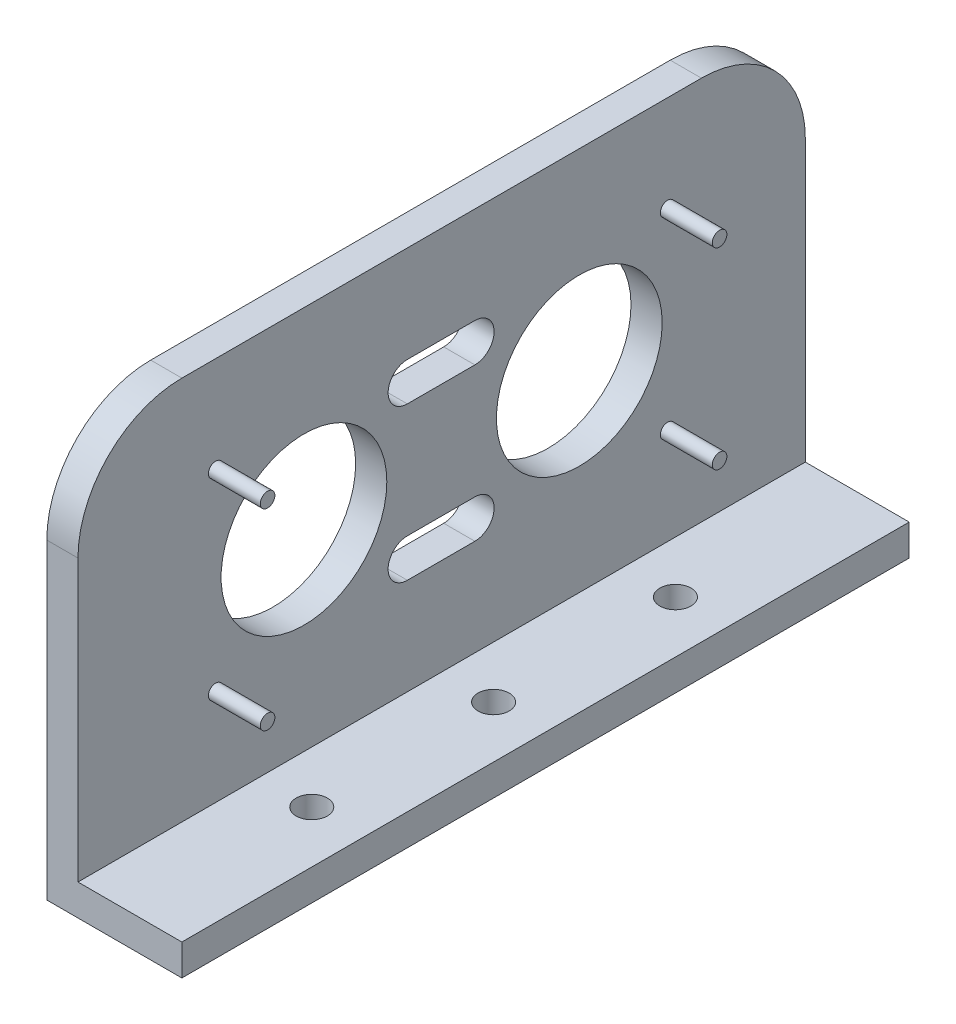
ISO-10303-21;
HEADER;
FILE_DESCRIPTION(('STEP AP214'),'2;1');
FILE_NAME('part.step','',(''),(''),'','','');
FILE_SCHEMA(('AUTOMOTIVE_DESIGN { 1 0 10303 214 1 1 1 1 }'));
ENDSEC;
DATA;
#1=APPLICATION_CONTEXT('core data for automotive mechanical design processes');
#2=APPLICATION_PROTOCOL_DEFINITION('international standard','automotive_design',2000,#1);
#3=PRODUCT_CONTEXT('',#1,'mechanical');
#4=PRODUCT('Part','Part','',(#3));
#5=PRODUCT_RELATED_PRODUCT_CATEGORY('part','',(#4));
#6=PRODUCT_DEFINITION_FORMATION('','',#4);
#7=PRODUCT_DEFINITION_CONTEXT('part definition',#1,'design');
#8=PRODUCT_DEFINITION('design','',#6,#7);
#9=PRODUCT_DEFINITION_SHAPE('','',#8);
#10=(LENGTH_UNIT() NAMED_UNIT(*) SI_UNIT(.MILLI.,.METRE.));
#11=(NAMED_UNIT(*) PLANE_ANGLE_UNIT() SI_UNIT($,.RADIAN.));
#12=(NAMED_UNIT(*) SI_UNIT($,.STERADIAN.) SOLID_ANGLE_UNIT());
#13=UNCERTAINTY_MEASURE_WITH_UNIT(LENGTH_MEASURE(1.E-05),#10,'distance_accuracy_value','');
#14=(GEOMETRIC_REPRESENTATION_CONTEXT(3) GLOBAL_UNCERTAINTY_ASSIGNED_CONTEXT((#13)) GLOBAL_UNIT_ASSIGNED_CONTEXT((#10,
#11,#12)) REPRESENTATION_CONTEXT('',''));
#15=CARTESIAN_POINT('',(0.,0.,0.));
#16=DIRECTION('',(0.,0.,1.));
#17=DIRECTION('',(1.,0.,0.));
#18=AXIS2_PLACEMENT_3D('',#15,#16,#17);
#19=CARTESIAN_POINT('',(-10.,30.,10.));
#20=DIRECTION('',(-1.,0.,0.));
#21=DIRECTION('',(0.,0.,1.));
#22=AXIS2_PLACEMENT_3D('',#19,#20,#21);
#23=CYLINDRICAL_SURFACE('',#22,10.);
#24=DIRECTION('',(-1.,0.,0.));
#25=VECTOR('',#24,1.);
#26=CARTESIAN_POINT('',(-10.,40.,10.));
#27=LINE('',#26,#25);
#28=CARTESIAN_POINT('',(-10.,40.,9.99999999999999));
#29=VERTEX_POINT('',#28);
#30=CARTESIAN_POINT('',(-13.,40.,9.99999999999999));
#31=VERTEX_POINT('',#30);
#32=EDGE_CURVE('E339',#29,#31,#27,.T.);
#33=ORIENTED_EDGE('',*,*,#32,.F.);
#34=CARTESIAN_POINT('',(-10.,30.,10.));
#35=DIRECTION('',(-1.,0.,0.));
#36=DIRECTION('',(0.,-1.,0.));
#37=AXIS2_PLACEMENT_3D('',#34,#35,#36);
#38=CIRCLE('',#37,10.);
#39=CARTESIAN_POINT('',(-10.,30.,0.));
#40=VERTEX_POINT('',#39);
#41=EDGE_CURVE('E347',#40,#29,#38,.F.);
#42=ORIENTED_EDGE('',*,*,#41,.F.);
#43=DIRECTION('',(-1.,0.,0.));
#44=VECTOR('',#43,1.);
#45=CARTESIAN_POINT('',(0.,30.,0.));
#46=LINE('',#45,#44);
#47=CARTESIAN_POINT('',(-13.,30.,0.));
#48=VERTEX_POINT('',#47);
#49=EDGE_CURVE('E343',#48,#40,#46,.F.);
#50=ORIENTED_EDGE('',*,*,#49,.F.);
#51=CARTESIAN_POINT('',(-13.,30.,10.));
#52=DIRECTION('',(1.,0.,0.));
#53=DIRECTION('',(0.,1.,0.));
#54=AXIS2_PLACEMENT_3D('',#51,#52,#53);
#55=CIRCLE('',#54,10.);
#56=EDGE_CURVE('E350',#31,#48,#55,.F.);
#57=ORIENTED_EDGE('',*,*,#56,.F.);
#58=EDGE_LOOP('',(#33,#42,#50,#57));
#59=FACE_BOUND('',#58,.T.);
#60=ADVANCED_FACE('F47',(#59),#23,.T.);
#61=CARTESIAN_POINT('',(-10.,30.,60.));
#62=DIRECTION('',(-1.,0.,0.));
#63=DIRECTION('',(0.,0.,1.));
#64=AXIS2_PLACEMENT_3D('',#61,#62,#63);
#65=CYLINDRICAL_SURFACE('',#64,10.);
#66=DIRECTION('',(1.,0.,0.));
#67=VECTOR('',#66,1.);
#68=CARTESIAN_POINT('',(-10.,40.,60.));
#69=LINE('',#68,#67);
#70=CARTESIAN_POINT('',(-13.,40.,60.));
#71=VERTEX_POINT('',#70);
#72=CARTESIAN_POINT('',(-10.,40.,60.));
#73=VERTEX_POINT('',#72);
#74=EDGE_CURVE('E325',#71,#73,#69,.T.);
#75=ORIENTED_EDGE('',*,*,#74,.F.);
#76=CARTESIAN_POINT('',(-13.,30.,60.));
#77=DIRECTION('',(1.,0.,0.));
#78=DIRECTION('',(0.,1.,0.));
#79=AXIS2_PLACEMENT_3D('',#76,#77,#78);
#80=CIRCLE('',#79,10.);
#81=CARTESIAN_POINT('',(-13.,30.,70.));
#82=VERTEX_POINT('',#81);
#83=EDGE_CURVE('E333',#82,#71,#80,.F.);
#84=ORIENTED_EDGE('',*,*,#83,.F.);
#85=DIRECTION('',(1.,0.,0.));
#86=VECTOR('',#85,1.);
#87=CARTESIAN_POINT('',(-10.,30.,70.));
#88=LINE('',#87,#86);
#89=CARTESIAN_POINT('',(-10.,30.,70.));
#90=VERTEX_POINT('',#89);
#91=EDGE_CURVE('E329',#90,#82,#88,.F.);
#92=ORIENTED_EDGE('',*,*,#91,.F.);
#93=CARTESIAN_POINT('',(-10.,30.,60.));
#94=DIRECTION('',(-1.,0.,0.));
#95=DIRECTION('',(0.,-1.,0.));
#96=AXIS2_PLACEMENT_3D('',#93,#94,#95);
#97=CIRCLE('',#96,10.);
#98=EDGE_CURVE('E336',#73,#90,#97,.F.);
#99=ORIENTED_EDGE('',*,*,#98,.F.);
#100=EDGE_LOOP('',(#75,#84,#92,#99));
#101=FACE_BOUND('',#100,.T.);
#102=ADVANCED_FACE('F426',(#101),#65,.T.);
#103=CARTESIAN_POINT('',(-10.,40.,70.));
#104=DIRECTION('',(0.,-1.,0.));
#105=DIRECTION('',(0.,0.,-1.));
#106=AXIS2_PLACEMENT_3D('',#103,#104,#105);
#107=PLANE('',#106);
#108=DIRECTION('',(0.,0.,-1.));
#109=VECTOR('',#108,1.);
#110=CARTESIAN_POINT('',(-10.,40.,70.));
#111=LINE('',#110,#109);
#112=EDGE_CURVE('E287',#73,#29,#111,.T.);
#113=ORIENTED_EDGE('',*,*,#112,.T.);
#114=ORIENTED_EDGE('',*,*,#32,.T.);
#115=DIRECTION('',(0.,0.,-1.));
#116=VECTOR('',#115,1.);
#117=CARTESIAN_POINT('',(-13.,40.,70.));
#118=LINE('',#117,#116);
#119=EDGE_CURVE('E321',#71,#31,#118,.T.);
#120=ORIENTED_EDGE('',*,*,#119,.F.);
#121=ORIENTED_EDGE('',*,*,#74,.T.);
#122=EDGE_LOOP('',(#113,#114,#120,#121));
#123=FACE_BOUND('',#122,.T.);
#124=ADVANCED_FACE('F433',(#123),#107,.F.);
#125=CARTESIAN_POINT('',(-13.,40.,70.));
#126=DIRECTION('',(1.,0.,0.));
#127=DIRECTION('',(0.,1.,0.));
#128=AXIS2_PLACEMENT_3D('',#125,#126,#127);
#129=PLANE('',#128);
#130=DIRECTION('',(0.,0.,-1.));
#131=VECTOR('',#130,1.);
#132=CARTESIAN_POINT('',(-13.,30.7,38.3));
#133=LINE('',#132,#131);
#134=CARTESIAN_POINT('',(-13.,30.7,38.3));
#135=VERTEX_POINT('',#134);
#136=CARTESIAN_POINT('',(-13.,30.7,31.8));
#137=VERTEX_POINT('',#136);
#138=EDGE_CURVE('E180',#135,#137,#133,.T.);
#139=ORIENTED_EDGE('',*,*,#138,.F.);
#140=CARTESIAN_POINT('',(-13.,28.85,38.3));
#141=DIRECTION('',(-1.,0.,0.));
#142=DIRECTION('',(0.,-1.,0.));
#143=AXIS2_PLACEMENT_3D('',#140,#141,#142);
#144=CIRCLE('',#143,1.85);
#145=CARTESIAN_POINT('',(-13.,27.,38.3));
#146=VERTEX_POINT('',#145);
#147=EDGE_CURVE('E64',#146,#135,#144,.T.);
#148=ORIENTED_EDGE('',*,*,#147,.F.);
#149=DIRECTION('',(0.,0.,1.));
#150=VECTOR('',#149,1.);
#151=CARTESIAN_POINT('',(-13.,27.,38.3));
#152=LINE('',#151,#150);
#153=CARTESIAN_POINT('',(-13.,27.,31.8));
#154=VERTEX_POINT('',#153);
#155=EDGE_CURVE('E188',#154,#146,#152,.T.);
#156=ORIENTED_EDGE('',*,*,#155,.F.);
#157=CARTESIAN_POINT('',(-13.,28.85,31.8));
#158=DIRECTION('',(-1.,0.,0.));
#159=DIRECTION('',(0.,-1.,0.));
#160=AXIS2_PLACEMENT_3D('',#157,#158,#159);
#161=CIRCLE('',#160,1.85);
#162=EDGE_CURVE('E169',#137,#154,#161,.T.);
#163=ORIENTED_EDGE('',*,*,#162,.F.);
#164=EDGE_LOOP('',(#139,#148,#156,#163));
#165=FACE_BOUND('',#164,.T.);
#166=DIRECTION('',(0.,0.,-1.));
#167=VECTOR('',#166,1.);
#168=CARTESIAN_POINT('',(-13.,16.,38.3));
#169=LINE('',#168,#167);
#170=CARTESIAN_POINT('',(-13.,16.,38.3));
#171=VERTEX_POINT('',#170);
#172=CARTESIAN_POINT('',(-13.,16.,31.8));
#173=VERTEX_POINT('',#172);
#174=EDGE_CURVE('E224',#171,#173,#169,.T.);
#175=ORIENTED_EDGE('',*,*,#174,.F.);
#176=CARTESIAN_POINT('',(-13.,14.15,38.3));
#177=DIRECTION('',(-1.,0.,0.));
#178=DIRECTION('',(0.,1.,0.));
#179=AXIS2_PLACEMENT_3D('',#176,#177,#178);
#180=CIRCLE('',#179,1.85);
#181=CARTESIAN_POINT('',(-13.,12.3,38.3));
#182=VERTEX_POINT('',#181);
#183=EDGE_CURVE('E72',#182,#171,#180,.T.);
#184=ORIENTED_EDGE('',*,*,#183,.F.);
#185=DIRECTION('',(0.,0.,1.));
#186=VECTOR('',#185,1.);
#187=CARTESIAN_POINT('',(-13.,12.3,38.3));
#188=LINE('',#187,#186);
#189=CARTESIAN_POINT('',(-13.,12.3,31.8));
#190=VERTEX_POINT('',#189);
#191=EDGE_CURVE('E206',#190,#182,#188,.T.);
#192=ORIENTED_EDGE('',*,*,#191,.F.);
#193=CARTESIAN_POINT('',(-13.,14.15,31.8));
#194=DIRECTION('',(-1.,0.,0.));
#195=DIRECTION('',(0.,1.,0.));
#196=AXIS2_PLACEMENT_3D('',#193,#194,#195);
#197=CIRCLE('',#196,1.85);
#198=EDGE_CURVE('E220',#173,#190,#197,.T.);
#199=ORIENTED_EDGE('',*,*,#198,.F.);
#200=EDGE_LOOP('',(#175,#184,#192,#199));
#201=FACE_BOUND('',#200,.T.);
#202=CARTESIAN_POINT('',(-13.,21.5,21.75));
#203=DIRECTION('',(1.,0.,0.));
#204=DIRECTION('',(0.,0.,-1.));
#205=AXIS2_PLACEMENT_3D('',#202,#203,#204);
#206=CIRCLE('',#205,7.975);
#207=CARTESIAN_POINT('',(-13.,21.5,13.775));
#208=VERTEX_POINT('',#207);
#209=EDGE_CURVE('E254',#208,#208,#206,.T.);
#210=ORIENTED_EDGE('',*,*,#209,.T.);
#211=EDGE_LOOP('',(#210));
#212=FACE_BOUND('',#211,.T.);
#213=CARTESIAN_POINT('',(-13.,21.5,48.25));
#214=DIRECTION('',(1.,0.,0.));
#215=DIRECTION('',(0.,0.,-1.));
#216=AXIS2_PLACEMENT_3D('',#213,#214,#215);
#217=CIRCLE('',#216,7.975);
#218=CARTESIAN_POINT('',(-13.,21.5,40.275));
#219=VERTEX_POINT('',#218);
#220=EDGE_CURVE('E262',#219,#219,#217,.T.);
#221=ORIENTED_EDGE('',*,*,#220,.T.);
#222=EDGE_LOOP('',(#221));
#223=FACE_BOUND('',#222,.T.);
#224=ORIENTED_EDGE('',*,*,#119,.T.);
#225=ORIENTED_EDGE('',*,*,#56,.T.);
#226=DIRECTION('',(0.,-1.,0.));
#227=VECTOR('',#226,1.);
#228=CARTESIAN_POINT('',(-13.,40.,0.));
#229=LINE('',#228,#227);
#230=CARTESIAN_POINT('',(-13.,0.,0.));
#231=VERTEX_POINT('',#230);
#232=EDGE_CURVE('E266',#48,#231,#229,.T.);
#233=ORIENTED_EDGE('',*,*,#232,.T.);
#234=DIRECTION('',(0.,0.,-1.));
#235=VECTOR('',#234,1.);
#236=CARTESIAN_POINT('',(-13.,0.,70.));
#237=LINE('',#236,#235);
#238=CARTESIAN_POINT('',(-13.,0.,70.));
#239=VERTEX_POINT('',#238);
#240=EDGE_CURVE('E317',#239,#231,#237,.T.);
#241=ORIENTED_EDGE('',*,*,#240,.F.);
#242=DIRECTION('',(0.,-1.,0.));
#243=VECTOR('',#242,1.);
#244=CARTESIAN_POINT('',(-13.,40.,70.));
#245=LINE('',#244,#243);
#246=EDGE_CURVE('E270',#82,#239,#245,.T.);
#247=ORIENTED_EDGE('',*,*,#246,.F.);
#248=ORIENTED_EDGE('',*,*,#83,.T.);
#249=EDGE_LOOP('',(#224,#225,#233,#241,#247,#248));
#250=FACE_BOUND('',#249,.T.);
#251=ADVANCED_FACE('F185',(#165,#201,#212,#223,#250),#129,.F.);
#252=CARTESIAN_POINT('',(-13.,0.,70.));
#253=DIRECTION('',(0.,1.,0.));
#254=DIRECTION('',(0.,0.,1.));
#255=AXIS2_PLACEMENT_3D('',#252,#253,#254);
#256=PLANE('',#255);
#257=CARTESIAN_POINT('',(-5.,0.,17.5));
#258=DIRECTION('',(0.,1.,0.));
#259=DIRECTION('',(0.,0.,1.));
#260=AXIS2_PLACEMENT_3D('',#257,#258,#259);
#261=CIRCLE('',#260,1.5);
#262=CARTESIAN_POINT('',(-5.,0.,19.));
#263=VERTEX_POINT('',#262);
#264=EDGE_CURVE('E198',#263,#263,#261,.T.);
#265=ORIENTED_EDGE('',*,*,#264,.T.);
#266=EDGE_LOOP('',(#265));
#267=FACE_BOUND('',#266,.T.);
#268=CARTESIAN_POINT('',(-5.,0.,52.5));
#269=DIRECTION('',(0.,1.,0.));
#270=DIRECTION('',(0.,0.,1.));
#271=AXIS2_PLACEMENT_3D('',#268,#269,#270);
#272=CIRCLE('',#271,1.5);
#273=CARTESIAN_POINT('',(-5.,0.,54.));
#274=VERTEX_POINT('',#273);
#275=EDGE_CURVE('E235',#274,#274,#272,.T.);
#276=ORIENTED_EDGE('',*,*,#275,.T.);
#277=EDGE_LOOP('',(#276));
#278=FACE_BOUND('',#277,.T.);
#279=CARTESIAN_POINT('',(-5.,0.,35.));
#280=DIRECTION('',(0.,1.,0.));
#281=DIRECTION('',(0.,0.,1.));
#282=AXIS2_PLACEMENT_3D('',#279,#280,#281);
#283=CIRCLE('',#282,1.5);
#284=CARTESIAN_POINT('',(-5.,0.,36.5));
#285=VERTEX_POINT('',#284);
#286=EDGE_CURVE('E246',#285,#285,#283,.T.);
#287=ORIENTED_EDGE('',*,*,#286,.T.);
#288=EDGE_LOOP('',(#287));
#289=FACE_BOUND('',#288,.T.);
#290=DIRECTION('',(1.,0.,0.));
#291=VECTOR('',#290,1.);
#292=CARTESIAN_POINT('',(-13.,0.,0.));
#293=LINE('',#292,#291);
#294=CARTESIAN_POINT('',(0.,0.,0.));
#295=VERTEX_POINT('',#294);
#296=EDGE_CURVE('E290',#231,#295,#293,.T.);
#297=ORIENTED_EDGE('',*,*,#296,.T.);
#298=DIRECTION('',(0.,0.,-1.));
#299=VECTOR('',#298,1.);
#300=CARTESIAN_POINT('',(0.,0.,70.));
#301=LINE('',#300,#299);
#302=CARTESIAN_POINT('',(0.,0.,70.));
#303=VERTEX_POINT('',#302);
#304=EDGE_CURVE('E313',#303,#295,#301,.T.);
#305=ORIENTED_EDGE('',*,*,#304,.F.);
#306=DIRECTION('',(1.,0.,0.));
#307=VECTOR('',#306,1.);
#308=CARTESIAN_POINT('',(-13.,0.,70.));
#309=LINE('',#308,#307);
#310=EDGE_CURVE('E273',#239,#303,#309,.T.);
#311=ORIENTED_EDGE('',*,*,#310,.F.);
#312=ORIENTED_EDGE('',*,*,#240,.T.);
#313=EDGE_LOOP('',(#297,#305,#311,#312));
#314=FACE_BOUND('',#313,.T.);
#315=ADVANCED_FACE('F458',(#267,#278,#289,#314),#256,.F.);
#316=CARTESIAN_POINT('',(0.,0.,70.));
#317=DIRECTION('',(-1.,0.,0.));
#318=DIRECTION('',(0.,0.,1.));
#319=AXIS2_PLACEMENT_3D('',#316,#317,#318);
#320=PLANE('',#319);
#321=DIRECTION('',(0.,1.,0.));
#322=VECTOR('',#321,1.);
#323=CARTESIAN_POINT('',(0.,0.,0.));
#324=LINE('',#323,#322);
#325=CARTESIAN_POINT('',(0.,3.,0.));
#326=VERTEX_POINT('',#325);
#327=EDGE_CURVE('E293',#295,#326,#324,.T.);
#328=ORIENTED_EDGE('',*,*,#327,.T.);
#329=DIRECTION('',(0.,0.,-1.));
#330=VECTOR('',#329,1.);
#331=CARTESIAN_POINT('',(0.,3.,70.));
#332=LINE('',#331,#330);
#333=CARTESIAN_POINT('',(0.,3.,70.));
#334=VERTEX_POINT('',#333);
#335=EDGE_CURVE('E309',#334,#326,#332,.T.);
#336=ORIENTED_EDGE('',*,*,#335,.F.);
#337=DIRECTION('',(0.,1.,0.));
#338=VECTOR('',#337,1.);
#339=CARTESIAN_POINT('',(0.,0.,70.));
#340=LINE('',#339,#338);
#341=EDGE_CURVE('E277',#303,#334,#340,.T.);
#342=ORIENTED_EDGE('',*,*,#341,.F.);
#343=ORIENTED_EDGE('',*,*,#304,.T.);
#344=EDGE_LOOP('',(#328,#336,#342,#343));
#345=FACE_BOUND('',#344,.T.);
#346=ADVANCED_FACE('F468',(#345),#320,.F.);
#347=CARTESIAN_POINT('',(0.,3.,70.));
#348=DIRECTION('',(0.,-1.,0.));
#349=DIRECTION('',(0.,0.,-1.));
#350=AXIS2_PLACEMENT_3D('',#347,#348,#349);
#351=PLANE('',#350);
#352=CARTESIAN_POINT('',(-5.,3.,17.5));
#353=DIRECTION('',(0.,1.,0.));
#354=DIRECTION('',(0.,0.,1.));
#355=AXIS2_PLACEMENT_3D('',#352,#353,#354);
#356=CIRCLE('',#355,1.5);
#357=CARTESIAN_POINT('',(-5.,3.,19.));
#358=VERTEX_POINT('',#357);
#359=EDGE_CURVE('E239',#358,#358,#356,.T.);
#360=ORIENTED_EDGE('',*,*,#359,.F.);
#361=EDGE_LOOP('',(#360));
#362=FACE_BOUND('',#361,.T.);
#363=CARTESIAN_POINT('',(-5.,3.,52.5));
#364=DIRECTION('',(0.,1.,0.));
#365=DIRECTION('',(0.,0.,1.));
#366=AXIS2_PLACEMENT_3D('',#363,#364,#365);
#367=CIRCLE('',#366,1.5);
#368=CARTESIAN_POINT('',(-5.,3.,54.));
#369=VERTEX_POINT('',#368);
#370=EDGE_CURVE('E230',#369,#369,#367,.T.);
#371=ORIENTED_EDGE('',*,*,#370,.F.);
#372=EDGE_LOOP('',(#371));
#373=FACE_BOUND('',#372,.T.);
#374=CARTESIAN_POINT('',(-5.,3.,35.));
#375=DIRECTION('',(0.,1.,0.));
#376=DIRECTION('',(0.,0.,1.));
#377=AXIS2_PLACEMENT_3D('',#374,#375,#376);
#378=CIRCLE('',#377,1.5);
#379=CARTESIAN_POINT('',(-5.,3.,36.5));
#380=VERTEX_POINT('',#379);
#381=EDGE_CURVE('E234',#380,#380,#378,.T.);
#382=ORIENTED_EDGE('',*,*,#381,.F.);
#383=EDGE_LOOP('',(#382));
#384=FACE_BOUND('',#383,.T.);
#385=DIRECTION('',(-1.,0.,0.));
#386=VECTOR('',#385,1.);
#387=CARTESIAN_POINT('',(0.,3.,0.));
#388=LINE('',#387,#386);
#389=CARTESIAN_POINT('',(-10.,3.,0.));
#390=VERTEX_POINT('',#389);
#391=EDGE_CURVE('E296',#326,#390,#388,.T.);
#392=ORIENTED_EDGE('',*,*,#391,.T.);
#393=DIRECTION('',(0.,0.,-1.));
#394=VECTOR('',#393,1.);
#395=CARTESIAN_POINT('',(-10.,3.,70.));
#396=LINE('',#395,#394);
#397=CARTESIAN_POINT('',(-10.,3.,70.));
#398=VERTEX_POINT('',#397);
#399=EDGE_CURVE('E305',#398,#390,#396,.T.);
#400=ORIENTED_EDGE('',*,*,#399,.F.);
#401=DIRECTION('',(-1.,0.,0.));
#402=VECTOR('',#401,1.);
#403=CARTESIAN_POINT('',(0.,3.,70.));
#404=LINE('',#403,#402);
#405=EDGE_CURVE('E280',#334,#398,#404,.T.);
#406=ORIENTED_EDGE('',*,*,#405,.F.);
#407=ORIENTED_EDGE('',*,*,#335,.T.);
#408=EDGE_LOOP('',(#392,#400,#406,#407));
#409=FACE_BOUND('',#408,.T.);
#410=ADVANCED_FACE('F466',(#362,#373,#384,#409),#351,.F.);
#411=CARTESIAN_POINT('',(-10.,3.,70.));
#412=DIRECTION('',(-1.,0.,0.));
#413=DIRECTION('',(0.,-1.,0.));
#414=AXIS2_PLACEMENT_3D('',#411,#412,#413);
#415=PLANE('',#414);
#416=CARTESIAN_POINT('',(-10.,12.25,13.25));
#417=DIRECTION('',(-1.,0.,0.));
#418=DIRECTION('',(0.,-1.,0.));
#419=AXIS2_PLACEMENT_3D('',#416,#417,#418);
#420=CIRCLE('',#419,0.699999999999999);
#421=CARTESIAN_POINT('',(-10.,11.55,13.25));
#422=VERTEX_POINT('',#421);
#423=EDGE_CURVE('E50',#422,#422,#420,.T.);
#424=ORIENTED_EDGE('',*,*,#423,.T.);
#425=EDGE_LOOP('',(#424));
#426=FACE_BOUND('',#425,.T.);
#427=CARTESIAN_POINT('',(-10.,30.75,13.25));
#428=DIRECTION('',(-1.,0.,0.));
#429=DIRECTION('',(0.,-1.,0.));
#430=AXIS2_PLACEMENT_3D('',#427,#428,#429);
#431=CIRCLE('',#430,0.699999999999999);
#432=CARTESIAN_POINT('',(-10.,30.05,13.25));
#433=VERTEX_POINT('',#432);
#434=EDGE_CURVE('E385',#433,#433,#431,.T.);
#435=ORIENTED_EDGE('',*,*,#434,.T.);
#436=EDGE_LOOP('',(#435));
#437=FACE_BOUND('',#436,.T.);
#438=CARTESIAN_POINT('',(-10.,12.25,56.75));
#439=DIRECTION('',(-1.,0.,0.));
#440=DIRECTION('',(0.,-1.,0.));
#441=AXIS2_PLACEMENT_3D('',#438,#439,#440);
#442=CIRCLE('',#441,0.700000000000001);
#443=CARTESIAN_POINT('',(-10.,11.55,56.75));
#444=VERTEX_POINT('',#443);
#445=EDGE_CURVE('E381',#444,#444,#442,.T.);
#446=ORIENTED_EDGE('',*,*,#445,.T.);
#447=EDGE_LOOP('',(#446));
#448=FACE_BOUND('',#447,.T.);
#449=CARTESIAN_POINT('',(-10.,30.75,56.75));
#450=DIRECTION('',(-1.,0.,0.));
#451=DIRECTION('',(0.,-1.,0.));
#452=AXIS2_PLACEMENT_3D('',#449,#450,#451);
#453=CIRCLE('',#452,0.700000000000001);
#454=CARTESIAN_POINT('',(-10.,30.05,56.75));
#455=VERTEX_POINT('',#454);
#456=EDGE_CURVE('E216',#455,#455,#453,.T.);
#457=ORIENTED_EDGE('',*,*,#456,.T.);
#458=EDGE_LOOP('',(#457));
#459=FACE_BOUND('',#458,.T.);
#460=DIRECTION('',(0.,0.,1.));
#461=VECTOR('',#460,1.);
#462=CARTESIAN_POINT('',(-10.,27.,70.));
#463=LINE('',#462,#461);
#464=CARTESIAN_POINT('',(-10.,27.,31.8));
#465=VERTEX_POINT('',#464);
#466=CARTESIAN_POINT('',(-10.,27.,38.3));
#467=VERTEX_POINT('',#466);
#468=EDGE_CURVE('E56',#465,#467,#463,.T.);
#469=ORIENTED_EDGE('',*,*,#468,.T.);
#470=CARTESIAN_POINT('',(-10.,28.85,38.3));
#471=DIRECTION('',(-1.,0.,0.));
#472=DIRECTION('',(0.,-1.,0.));
#473=AXIS2_PLACEMENT_3D('',#470,#471,#472);
#474=CIRCLE('',#473,1.85);
#475=CARTESIAN_POINT('',(-10.,30.7,38.3));
#476=VERTEX_POINT('',#475);
#477=EDGE_CURVE('E11',#467,#476,#474,.T.);
#478=ORIENTED_EDGE('',*,*,#477,.T.);
#479=DIRECTION('',(0.,0.,-1.));
#480=VECTOR('',#479,1.);
#481=CARTESIAN_POINT('',(-10.,30.7,70.));
#482=LINE('',#481,#480);
#483=CARTESIAN_POINT('',(-10.,30.7,31.8));
#484=VERTEX_POINT('',#483);
#485=EDGE_CURVE('E369',#476,#484,#482,.T.);
#486=ORIENTED_EDGE('',*,*,#485,.T.);
#487=CARTESIAN_POINT('',(-10.,28.85,31.8));
#488=DIRECTION('',(-1.,0.,0.));
#489=DIRECTION('',(0.,-1.,0.));
#490=AXIS2_PLACEMENT_3D('',#487,#488,#489);
#491=CIRCLE('',#490,1.85);
#492=EDGE_CURVE('E172',#484,#465,#491,.T.);
#493=ORIENTED_EDGE('',*,*,#492,.T.);
#494=EDGE_LOOP('',(#469,#478,#486,#493));
#495=FACE_BOUND('',#494,.T.);
#496=DIRECTION('',(0.,0.,1.));
#497=VECTOR('',#496,1.);
#498=CARTESIAN_POINT('',(-10.,12.3,70.));
#499=LINE('',#498,#497);
#500=CARTESIAN_POINT('',(-10.,12.3,31.8));
#501=VERTEX_POINT('',#500);
#502=CARTESIAN_POINT('',(-10.,12.3,38.3));
#503=VERTEX_POINT('',#502);
#504=EDGE_CURVE('E361',#501,#503,#499,.T.);
#505=ORIENTED_EDGE('',*,*,#504,.T.);
#506=CARTESIAN_POINT('',(-10.,14.15,38.3));
#507=DIRECTION('',(-1.,0.,0.));
#508=DIRECTION('',(0.,-1.,0.));
#509=AXIS2_PLACEMENT_3D('',#506,#507,#508);
#510=CIRCLE('',#509,1.85);
#511=CARTESIAN_POINT('',(-10.,16.,38.3));
#512=VERTEX_POINT('',#511);
#513=EDGE_CURVE('E365',#503,#512,#510,.T.);
#514=ORIENTED_EDGE('',*,*,#513,.T.);
#515=DIRECTION('',(0.,0.,-1.));
#516=VECTOR('',#515,1.);
#517=CARTESIAN_POINT('',(-10.,16.,70.));
#518=LINE('',#517,#516);
#519=CARTESIAN_POINT('',(-10.,16.,31.8));
#520=VERTEX_POINT('',#519);
#521=EDGE_CURVE('E353',#512,#520,#518,.T.);
#522=ORIENTED_EDGE('',*,*,#521,.T.);
#523=CARTESIAN_POINT('',(-10.,14.15,31.8));
#524=DIRECTION('',(-1.,0.,0.));
#525=DIRECTION('',(0.,-1.,0.));
#526=AXIS2_PLACEMENT_3D('',#523,#524,#525);
#527=CIRCLE('',#526,1.85);
#528=EDGE_CURVE('E357',#520,#501,#527,.T.);
#529=ORIENTED_EDGE('',*,*,#528,.T.);
#530=EDGE_LOOP('',(#505,#514,#522,#529));
#531=FACE_BOUND('',#530,.T.);
#532=CARTESIAN_POINT('',(-10.,21.5,21.75));
#533=DIRECTION('',(1.,0.,0.));
#534=DIRECTION('',(0.,0.,-1.));
#535=AXIS2_PLACEMENT_3D('',#532,#533,#534);
#536=CIRCLE('',#535,7.975);
#537=CARTESIAN_POINT('',(-10.,21.5,13.775));
#538=VERTEX_POINT('',#537);
#539=EDGE_CURVE('E250',#538,#538,#536,.T.);
#540=ORIENTED_EDGE('',*,*,#539,.F.);
#541=EDGE_LOOP('',(#540));
#542=FACE_BOUND('',#541,.T.);
#543=CARTESIAN_POINT('',(-10.,21.5,48.25));
#544=DIRECTION('',(1.,0.,0.));
#545=DIRECTION('',(0.,0.,-1.));
#546=AXIS2_PLACEMENT_3D('',#543,#544,#545);
#547=CIRCLE('',#546,7.975);
#548=CARTESIAN_POINT('',(-10.,21.5,40.275));
#549=VERTEX_POINT('',#548);
#550=EDGE_CURVE('E258',#549,#549,#547,.T.);
#551=ORIENTED_EDGE('',*,*,#550,.F.);
#552=EDGE_LOOP('',(#551));
#553=FACE_BOUND('',#552,.T.);
#554=DIRECTION('',(0.,1.,0.));
#555=VECTOR('',#554,1.);
#556=CARTESIAN_POINT('',(-10.,3.,0.));
#557=LINE('',#556,#555);
#558=EDGE_CURVE('E274',#390,#40,#557,.T.);
#559=ORIENTED_EDGE('',*,*,#558,.T.);
#560=ORIENTED_EDGE('',*,*,#41,.T.);
#561=ORIENTED_EDGE('',*,*,#112,.F.);
#562=ORIENTED_EDGE('',*,*,#98,.T.);
#563=DIRECTION('',(0.,1.,0.));
#564=VECTOR('',#563,1.);
#565=CARTESIAN_POINT('',(-10.,3.,70.));
#566=LINE('',#565,#564);
#567=EDGE_CURVE('E283',#398,#90,#566,.T.);
#568=ORIENTED_EDGE('',*,*,#567,.F.);
#569=ORIENTED_EDGE('',*,*,#399,.T.);
#570=EDGE_LOOP('',(#559,#560,#561,#562,#568,#569));
#571=FACE_BOUND('',#570,.T.);
#572=ADVANCED_FACE('F442',(#426,#437,#448,#459,#495,#531,#542,#553,#571),#415,.F.);
#573=CARTESIAN_POINT('',(0.,0.,70.));
#574=DIRECTION('',(0.,0.,1.));
#575=DIRECTION('',(1.,0.,0.));
#576=AXIS2_PLACEMENT_3D('',#573,#574,#575);
#577=PLANE('',#576);
#578=ORIENTED_EDGE('',*,*,#567,.T.);
#579=ORIENTED_EDGE('',*,*,#91,.T.);
#580=ORIENTED_EDGE('',*,*,#246,.T.);
#581=ORIENTED_EDGE('',*,*,#310,.T.);
#582=ORIENTED_EDGE('',*,*,#341,.T.);
#583=ORIENTED_EDGE('',*,*,#405,.T.);
#584=EDGE_LOOP('',(#578,#579,#580,#581,#582,#583));
#585=FACE_BOUND('',#584,.T.);
#586=ADVANCED_FACE('F462',(#585),#577,.T.);
#587=CARTESIAN_POINT('',(0.,0.,0.));
#588=DIRECTION('',(0.,0.,1.));
#589=DIRECTION('',(1.,0.,0.));
#590=AXIS2_PLACEMENT_3D('',#587,#588,#589);
#591=PLANE('',#590);
#592=ORIENTED_EDGE('',*,*,#232,.F.);
#593=ORIENTED_EDGE('',*,*,#49,.T.);
#594=ORIENTED_EDGE('',*,*,#558,.F.);
#595=ORIENTED_EDGE('',*,*,#391,.F.);
#596=ORIENTED_EDGE('',*,*,#327,.F.);
#597=ORIENTED_EDGE('',*,*,#296,.F.);
#598=EDGE_LOOP('',(#592,#593,#594,#595,#596,#597));
#599=FACE_BOUND('',#598,.T.);
#600=ADVANCED_FACE('F450',(#599),#591,.F.);
#601=CARTESIAN_POINT('',(-13.,21.5,48.25));
#602=DIRECTION('',(1.,0.,0.));
#603=DIRECTION('',(0.,0.,-1.));
#604=AXIS2_PLACEMENT_3D('',#601,#602,#603);
#605=CYLINDRICAL_SURFACE('',#604,7.975);
#606=ORIENTED_EDGE('',*,*,#220,.F.);
#607=EDGE_LOOP('',(#606));
#608=FACE_BOUND('',#607,.T.);
#609=ORIENTED_EDGE('',*,*,#550,.T.);
#610=EDGE_LOOP('',(#609));
#611=FACE_BOUND('',#610,.T.);
#612=ADVANCED_FACE('F493',(#608,#611),#605,.F.);
#613=CARTESIAN_POINT('',(-13.,21.5,21.75));
#614=DIRECTION('',(1.,0.,0.));
#615=DIRECTION('',(0.,0.,-1.));
#616=AXIS2_PLACEMENT_3D('',#613,#614,#615);
#617=CYLINDRICAL_SURFACE('',#616,7.975);
#618=ORIENTED_EDGE('',*,*,#209,.F.);
#619=EDGE_LOOP('',(#618));
#620=FACE_BOUND('',#619,.T.);
#621=ORIENTED_EDGE('',*,*,#539,.T.);
#622=EDGE_LOOP('',(#621));
#623=FACE_BOUND('',#622,.T.);
#624=ADVANCED_FACE('F517',(#620,#623),#617,.F.);
#625=CARTESIAN_POINT('',(-5.,0.,35.));
#626=DIRECTION('',(0.,1.,0.));
#627=DIRECTION('',(0.,0.,1.));
#628=AXIS2_PLACEMENT_3D('',#625,#626,#627);
#629=CYLINDRICAL_SURFACE('',#628,1.5);
#630=ORIENTED_EDGE('',*,*,#286,.F.);
#631=EDGE_LOOP('',(#630));
#632=FACE_BOUND('',#631,.T.);
#633=ORIENTED_EDGE('',*,*,#381,.T.);
#634=EDGE_LOOP('',(#633));
#635=FACE_BOUND('',#634,.T.);
#636=ADVANCED_FACE('F512',(#632,#635),#629,.F.);
#637=CARTESIAN_POINT('',(-5.,0.,52.5));
#638=DIRECTION('',(0.,1.,0.));
#639=DIRECTION('',(0.,0.,1.));
#640=AXIS2_PLACEMENT_3D('',#637,#638,#639);
#641=CYLINDRICAL_SURFACE('',#640,1.5);
#642=ORIENTED_EDGE('',*,*,#275,.F.);
#643=EDGE_LOOP('',(#642));
#644=FACE_BOUND('',#643,.T.);
#645=ORIENTED_EDGE('',*,*,#370,.T.);
#646=EDGE_LOOP('',(#645));
#647=FACE_BOUND('',#646,.T.);
#648=ADVANCED_FACE('F516',(#644,#647),#641,.F.);
#649=CARTESIAN_POINT('',(-5.,0.,17.5));
#650=DIRECTION('',(0.,1.,0.));
#651=DIRECTION('',(0.,0.,1.));
#652=AXIS2_PLACEMENT_3D('',#649,#650,#651);
#653=CYLINDRICAL_SURFACE('',#652,1.5);
#654=ORIENTED_EDGE('',*,*,#264,.F.);
#655=EDGE_LOOP('',(#654));
#656=FACE_BOUND('',#655,.T.);
#657=ORIENTED_EDGE('',*,*,#359,.T.);
#658=EDGE_LOOP('',(#657));
#659=FACE_BOUND('',#658,.T.);
#660=ADVANCED_FACE('F526',(#656,#659),#653,.F.);
#661=CARTESIAN_POINT('',(0.,14.15,38.3));
#662=DIRECTION('',(-1.,0.,0.));
#663=DIRECTION('',(0.,-1.,0.));
#664=AXIS2_PLACEMENT_3D('',#661,#662,#663);
#665=CYLINDRICAL_SURFACE('',#664,1.85);
#666=DIRECTION('',(-1.,0.,0.));
#667=VECTOR('',#666,1.);
#668=CARTESIAN_POINT('',(0.,12.3,38.3));
#669=LINE('',#668,#667);
#670=EDGE_CURVE('E213',#503,#182,#669,.T.);
#671=ORIENTED_EDGE('',*,*,#670,.T.);
#672=ORIENTED_EDGE('',*,*,#183,.T.);
#673=DIRECTION('',(-1.,0.,0.));
#674=VECTOR('',#673,1.);
#675=CARTESIAN_POINT('',(0.,16.,38.3));
#676=LINE('',#675,#674);
#677=EDGE_CURVE('E203',#512,#171,#676,.T.);
#678=ORIENTED_EDGE('',*,*,#677,.F.);
#679=ORIENTED_EDGE('',*,*,#513,.F.);
#680=EDGE_LOOP('',(#671,#672,#678,#679));
#681=FACE_BOUND('',#680,.T.);
#682=ADVANCED_FACE('F535',(#681),#665,.F.);
#683=CARTESIAN_POINT('',(0.,12.3,38.3));
#684=DIRECTION('',(0.,-1.,0.));
#685=DIRECTION('',(1.,0.,0.));
#686=AXIS2_PLACEMENT_3D('',#683,#684,#685);
#687=PLANE('',#686);
#688=DIRECTION('',(-1.,0.,0.));
#689=VECTOR('',#688,1.);
#690=CARTESIAN_POINT('',(0.,12.3,31.8));
#691=LINE('',#690,#689);
#692=EDGE_CURVE('E210',#501,#190,#691,.T.);
#693=ORIENTED_EDGE('',*,*,#692,.T.);
#694=ORIENTED_EDGE('',*,*,#191,.T.);
#695=ORIENTED_EDGE('',*,*,#670,.F.);
#696=ORIENTED_EDGE('',*,*,#504,.F.);
#697=EDGE_LOOP('',(#693,#694,#695,#696));
#698=FACE_BOUND('',#697,.T.);
#699=ADVANCED_FACE('F544',(#698),#687,.F.);
#700=CARTESIAN_POINT('',(0.,14.15,31.8));
#701=DIRECTION('',(-1.,0.,0.));
#702=DIRECTION('',(0.,-1.,0.));
#703=AXIS2_PLACEMENT_3D('',#700,#701,#702);
#704=CYLINDRICAL_SURFACE('',#703,1.85);
#705=DIRECTION('',(-1.,0.,0.));
#706=VECTOR('',#705,1.);
#707=CARTESIAN_POINT('',(0.,16.,31.8));
#708=LINE('',#707,#706);
#709=EDGE_CURVE('E207',#520,#173,#708,.T.);
#710=ORIENTED_EDGE('',*,*,#709,.T.);
#711=ORIENTED_EDGE('',*,*,#198,.T.);
#712=ORIENTED_EDGE('',*,*,#692,.F.);
#713=ORIENTED_EDGE('',*,*,#528,.F.);
#714=EDGE_LOOP('',(#710,#711,#712,#713));
#715=FACE_BOUND('',#714,.T.);
#716=ADVANCED_FACE('F552',(#715),#704,.F.);
#717=CARTESIAN_POINT('',(0.,16.,38.3));
#718=DIRECTION('',(0.,1.,0.));
#719=DIRECTION('',(-1.,0.,0.));
#720=AXIS2_PLACEMENT_3D('',#717,#718,#719);
#721=PLANE('',#720);
#722=ORIENTED_EDGE('',*,*,#677,.T.);
#723=ORIENTED_EDGE('',*,*,#174,.T.);
#724=ORIENTED_EDGE('',*,*,#709,.F.);
#725=ORIENTED_EDGE('',*,*,#521,.F.);
#726=EDGE_LOOP('',(#722,#723,#724,#725));
#727=FACE_BOUND('',#726,.T.);
#728=ADVANCED_FACE('F561',(#727),#721,.F.);
#729=CARTESIAN_POINT('',(0.,28.85,38.3));
#730=DIRECTION('',(-1.,0.,0.));
#731=DIRECTION('',(0.,-1.,0.));
#732=AXIS2_PLACEMENT_3D('',#729,#730,#731);
#733=CYLINDRICAL_SURFACE('',#732,1.85);
#734=DIRECTION('',(-1.,0.,0.));
#735=VECTOR('',#734,1.);
#736=CARTESIAN_POINT('',(0.,27.,38.3));
#737=LINE('',#736,#735);
#738=EDGE_CURVE('E195',#467,#146,#737,.T.);
#739=ORIENTED_EDGE('',*,*,#738,.T.);
#740=ORIENTED_EDGE('',*,*,#147,.T.);
#741=DIRECTION('',(-1.,0.,0.));
#742=VECTOR('',#741,1.);
#743=CARTESIAN_POINT('',(0.,30.7,38.3));
#744=LINE('',#743,#742);
#745=EDGE_CURVE('E177',#476,#135,#744,.T.);
#746=ORIENTED_EDGE('',*,*,#745,.F.);
#747=ORIENTED_EDGE('',*,*,#477,.F.);
#748=EDGE_LOOP('',(#739,#740,#746,#747));
#749=FACE_BOUND('',#748,.T.);
#750=ADVANCED_FACE('F570',(#749),#733,.F.);
#751=CARTESIAN_POINT('',(0.,27.,38.3));
#752=DIRECTION('',(0.,-1.,0.));
#753=DIRECTION('',(1.,0.,0.));
#754=AXIS2_PLACEMENT_3D('',#751,#752,#753);
#755=PLANE('',#754);
#756=DIRECTION('',(-1.,0.,0.));
#757=VECTOR('',#756,1.);
#758=CARTESIAN_POINT('',(0.,27.,31.8));
#759=LINE('',#758,#757);
#760=EDGE_CURVE('E176',#465,#154,#759,.T.);
#761=ORIENTED_EDGE('',*,*,#760,.T.);
#762=ORIENTED_EDGE('',*,*,#155,.T.);
#763=ORIENTED_EDGE('',*,*,#738,.F.);
#764=ORIENTED_EDGE('',*,*,#468,.F.);
#765=EDGE_LOOP('',(#761,#762,#763,#764));
#766=FACE_BOUND('',#765,.T.);
#767=ADVANCED_FACE('F579',(#766),#755,.F.);
#768=CARTESIAN_POINT('',(0.,28.85,31.8));
#769=DIRECTION('',(-1.,0.,0.));
#770=DIRECTION('',(0.,-1.,0.));
#771=AXIS2_PLACEMENT_3D('',#768,#769,#770);
#772=CYLINDRICAL_SURFACE('',#771,1.85);
#773=DIRECTION('',(-1.,0.,0.));
#774=VECTOR('',#773,1.);
#775=CARTESIAN_POINT('',(0.,30.7,31.8));
#776=LINE('',#775,#774);
#777=EDGE_CURVE('E164',#484,#137,#776,.T.);
#778=ORIENTED_EDGE('',*,*,#777,.T.);
#779=ORIENTED_EDGE('',*,*,#162,.T.);
#780=ORIENTED_EDGE('',*,*,#760,.F.);
#781=ORIENTED_EDGE('',*,*,#492,.F.);
#782=EDGE_LOOP('',(#778,#779,#780,#781));
#783=FACE_BOUND('',#782,.T.);
#784=ADVANCED_FACE('F166',(#783),#772,.F.);
#785=CARTESIAN_POINT('',(0.,30.7,38.3));
#786=DIRECTION('',(0.,1.,0.));
#787=DIRECTION('',(-1.,0.,0.));
#788=AXIS2_PLACEMENT_3D('',#785,#786,#787);
#789=PLANE('',#788);
#790=ORIENTED_EDGE('',*,*,#745,.T.);
#791=ORIENTED_EDGE('',*,*,#138,.T.);
#792=ORIENTED_EDGE('',*,*,#777,.F.);
#793=ORIENTED_EDGE('',*,*,#485,.F.);
#794=EDGE_LOOP('',(#790,#791,#792,#793));
#795=FACE_BOUND('',#794,.T.);
#796=ADVANCED_FACE('F181',(#795),#789,.F.);
#797=CARTESIAN_POINT('',(-5.,30.75,56.75));
#798=DIRECTION('',(-1.,0.,0.));
#799=DIRECTION('',(0.,-1.,0.));
#800=AXIS2_PLACEMENT_3D('',#797,#798,#799);
#801=CYLINDRICAL_SURFACE('',#800,0.700000000000001);
#802=CARTESIAN_POINT('',(-5.,30.75,56.75));
#803=DIRECTION('',(-1.,0.,0.));
#804=DIRECTION('',(0.,-1.,0.));
#805=AXIS2_PLACEMENT_3D('',#802,#803,#804);
#806=CIRCLE('',#805,0.700000000000001);
#807=CARTESIAN_POINT('',(-5.,30.05,56.75));
#808=VERTEX_POINT('',#807);
#809=EDGE_CURVE('E380',#808,#808,#806,.T.);
#810=ORIENTED_EDGE('',*,*,#809,.T.);
#811=EDGE_LOOP('',(#810));
#812=FACE_BOUND('',#811,.T.);
#813=ORIENTED_EDGE('',*,*,#456,.F.);
#814=EDGE_LOOP('',(#813));
#815=FACE_BOUND('',#814,.T.);
#816=ADVANCED_FACE('F409',(#812,#815),#801,.T.);
#817=CARTESIAN_POINT('',(-5.,30.75,56.75));
#818=DIRECTION('',(-1.,0.,0.));
#819=DIRECTION('',(0.,-1.,0.));
#820=AXIS2_PLACEMENT_3D('',#817,#818,#819);
#821=PLANE('',#820);
#822=ORIENTED_EDGE('',*,*,#809,.F.);
#823=EDGE_LOOP('',(#822));
#824=FACE_BOUND('',#823,.T.);
#825=ADVANCED_FACE('F412',(#824),#821,.F.);
#826=CARTESIAN_POINT('',(-4.99999999999999,12.25,56.75));
#827=DIRECTION('',(-1.,0.,0.));
#828=DIRECTION('',(0.,-1.,0.));
#829=AXIS2_PLACEMENT_3D('',#826,#827,#828);
#830=CYLINDRICAL_SURFACE('',#829,0.700000000000001);
#831=CARTESIAN_POINT('',(-4.99999999999999,12.25,56.75));
#832=DIRECTION('',(-1.,0.,0.));
#833=DIRECTION('',(0.,1.,0.));
#834=AXIS2_PLACEMENT_3D('',#831,#832,#833);
#835=CIRCLE('',#834,0.700000000000001);
#836=CARTESIAN_POINT('',(-4.99999999999999,12.95,56.75));
#837=VERTEX_POINT('',#836);
#838=EDGE_CURVE('E384',#837,#837,#835,.T.);
#839=ORIENTED_EDGE('',*,*,#838,.T.);
#840=EDGE_LOOP('',(#839));
#841=FACE_BOUND('',#840,.T.);
#842=ORIENTED_EDGE('',*,*,#445,.F.);
#843=EDGE_LOOP('',(#842));
#844=FACE_BOUND('',#843,.T.);
#845=ADVANCED_FACE('F414',(#841,#844),#830,.T.);
#846=CARTESIAN_POINT('',(-4.99999999999999,12.25,56.75));
#847=DIRECTION('',(1.,0.,0.));
#848=DIRECTION('',(0.,1.,0.));
#849=AXIS2_PLACEMENT_3D('',#846,#847,#848);
#850=PLANE('',#849);
#851=ORIENTED_EDGE('',*,*,#838,.F.);
#852=EDGE_LOOP('',(#851));
#853=FACE_BOUND('',#852,.T.);
#854=ADVANCED_FACE('F420',(#853),#850,.T.);
#855=CARTESIAN_POINT('',(-5.,30.75,13.25));
#856=DIRECTION('',(-1.,0.,0.));
#857=DIRECTION('',(0.,-1.,0.));
#858=AXIS2_PLACEMENT_3D('',#855,#856,#857);
#859=CYLINDRICAL_SURFACE('',#858,0.699999999999999);
#860=CARTESIAN_POINT('',(-5.,30.75,13.25));
#861=DIRECTION('',(-1.,0.,0.));
#862=DIRECTION('',(0.,-1.,0.));
#863=AXIS2_PLACEMENT_3D('',#860,#861,#862);
#864=CIRCLE('',#863,0.699999999999999);
#865=CARTESIAN_POINT('',(-5.,30.05,13.25));
#866=VERTEX_POINT('',#865);
#867=EDGE_CURVE('E388',#866,#866,#864,.T.);
#868=ORIENTED_EDGE('',*,*,#867,.T.);
#869=EDGE_LOOP('',(#868));
#870=FACE_BOUND('',#869,.T.);
#871=ORIENTED_EDGE('',*,*,#434,.F.);
#872=EDGE_LOOP('',(#871));
#873=FACE_BOUND('',#872,.T.);
#874=ADVANCED_FACE('F637',(#870,#873),#859,.T.);
#875=CARTESIAN_POINT('',(-5.,30.75,13.25));
#876=DIRECTION('',(-1.,0.,0.));
#877=DIRECTION('',(0.,-1.,0.));
#878=AXIS2_PLACEMENT_3D('',#875,#876,#877);
#879=PLANE('',#878);
#880=ORIENTED_EDGE('',*,*,#867,.F.);
#881=EDGE_LOOP('',(#880));
#882=FACE_BOUND('',#881,.T.);
#883=ADVANCED_FACE('F646',(#882),#879,.F.);
#884=CARTESIAN_POINT('',(-4.99999999999999,12.25,13.25));
#885=DIRECTION('',(-1.,0.,0.));
#886=DIRECTION('',(0.,-1.,0.));
#887=AXIS2_PLACEMENT_3D('',#884,#885,#886);
#888=CYLINDRICAL_SURFACE('',#887,0.699999999999999);
#889=CARTESIAN_POINT('',(-4.99999999999999,12.25,13.25));
#890=DIRECTION('',(-1.,0.,0.));
#891=DIRECTION('',(0.,1.,0.));
#892=AXIS2_PLACEMENT_3D('',#889,#890,#891);
#893=CIRCLE('',#892,0.699999999999999);
#894=CARTESIAN_POINT('',(-4.99999999999999,12.95,13.25));
#895=VERTEX_POINT('',#894);
#896=EDGE_CURVE('E401',#895,#895,#893,.T.);
#897=ORIENTED_EDGE('',*,*,#896,.T.);
#898=EDGE_LOOP('',(#897));
#899=FACE_BOUND('',#898,.T.);
#900=ORIENTED_EDGE('',*,*,#423,.F.);
#901=EDGE_LOOP('',(#900));
#902=FACE_BOUND('',#901,.T.);
#903=ADVANCED_FACE('F655',(#899,#902),#888,.T.);
#904=CARTESIAN_POINT('',(-4.99999999999999,12.25,13.25));
#905=DIRECTION('',(1.,0.,0.));
#906=DIRECTION('',(0.,1.,0.));
#907=AXIS2_PLACEMENT_3D('',#904,#905,#906);
#908=PLANE('',#907);
#909=ORIENTED_EDGE('',*,*,#896,.F.);
#910=EDGE_LOOP('',(#909));
#911=FACE_BOUND('',#910,.T.);
#912=ADVANCED_FACE('F665',(#911),#908,.T.);
#913=CLOSED_SHELL('',(#60,#102,#124,#251,#315,#346,#410,#572,#586,#600,#612,#624,#636,#648,#660,
#682,#699,#716,#728,#750,#767,#784,#796,#816,#825,#845,#854,#874,#883,#903,#912));
#914=MANIFOLD_SOLID_BREP('B2',#913);
#915=ADVANCED_BREP_SHAPE_REPRESENTATION('',(#18,#914),#14);
#916=SHAPE_DEFINITION_REPRESENTATION(#9,#915);
ENDSEC;
END-ISO-10303-21;
